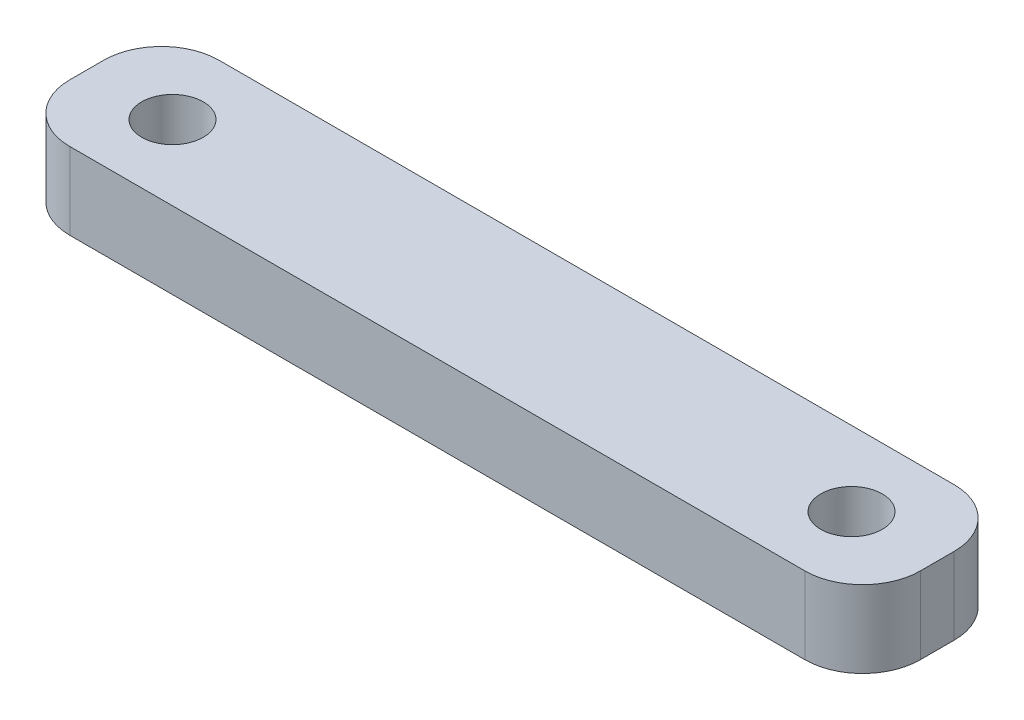
ISO-10303-21;
HEADER;
FILE_DESCRIPTION(('STEP AP214'),'2;1');
FILE_NAME('part.step','',(''),(''),'','','');
FILE_SCHEMA(('AUTOMOTIVE_DESIGN { 1 0 10303 214 1 1 1 1 }'));
ENDSEC;
DATA;
#1=APPLICATION_CONTEXT('core data for automotive mechanical design processes');
#2=APPLICATION_PROTOCOL_DEFINITION('international standard','automotive_design',2000,#1);
#3=PRODUCT_CONTEXT('',#1,'mechanical');
#4=PRODUCT('Part','Part','',(#3));
#5=PRODUCT_RELATED_PRODUCT_CATEGORY('part','',(#4));
#6=PRODUCT_DEFINITION_FORMATION('','',#4);
#7=PRODUCT_DEFINITION_CONTEXT('part definition',#1,'design');
#8=PRODUCT_DEFINITION('design','',#6,#7);
#9=PRODUCT_DEFINITION_SHAPE('','',#8);
#10=(LENGTH_UNIT() NAMED_UNIT(*) SI_UNIT(.MILLI.,.METRE.));
#11=(NAMED_UNIT(*) PLANE_ANGLE_UNIT() SI_UNIT($,.RADIAN.));
#12=(NAMED_UNIT(*) SI_UNIT($,.STERADIAN.) SOLID_ANGLE_UNIT());
#13=UNCERTAINTY_MEASURE_WITH_UNIT(LENGTH_MEASURE(1.E-05),#10,'distance_accuracy_value','');
#14=(GEOMETRIC_REPRESENTATION_CONTEXT(3) GLOBAL_UNCERTAINTY_ASSIGNED_CONTEXT((#13)) GLOBAL_UNIT_ASSIGNED_CONTEXT((#10,
#11,#12)) REPRESENTATION_CONTEXT('',''));
#15=CARTESIAN_POINT('',(0.,0.,0.));
#16=DIRECTION('',(0.,0.,1.));
#17=DIRECTION('',(1.,0.,0.));
#18=AXIS2_PLACEMENT_3D('',#15,#16,#17);
#19=CARTESIAN_POINT('',(0.,4.,0.));
#20=DIRECTION('',(0.,1.,0.));
#21=DIRECTION('',(0.,0.,1.));
#22=AXIS2_PLACEMENT_3D('',#19,#20,#21);
#23=PLANE('',#22);
#24=CARTESIAN_POINT('',(-17.65,4.,0.));
#25=DIRECTION('',(0.,1.,0.));
#26=DIRECTION('',(0.,0.,1.));
#27=AXIS2_PLACEMENT_3D('',#24,#25,#26);
#28=CIRCLE('',#27,1.6);
#29=CARTESIAN_POINT('',(-17.65,4.,1.6));
#30=VERTEX_POINT('',#29);
#31=EDGE_CURVE('E129',#30,#30,#28,.T.);
#32=ORIENTED_EDGE('',*,*,#31,.F.);
#33=EDGE_LOOP('',(#32));
#34=FACE_BOUND('',#33,.T.);
#35=DIRECTION('',(-1.,0.,0.));
#36=VECTOR('',#35,1.);
#37=CARTESIAN_POINT('',(22.1088511383018,4.,-3.88134356355615));
#38=LINE('',#37,#36);
#39=CARTESIAN_POINT('',(19.1088511383018,4.,-3.88134356355615));
#40=VERTEX_POINT('',#39);
#41=CARTESIAN_POINT('',(-19.1088511383018,4.,-3.88134356355615));
#42=VERTEX_POINT('',#41);
#43=EDGE_CURVE('E138',#40,#42,#38,.T.);
#44=ORIENTED_EDGE('',*,*,#43,.T.);
#45=CARTESIAN_POINT('',(-19.1088511383018,4.,-0.881343563556149));
#46=DIRECTION('',(0.,1.,0.));
#47=DIRECTION('',(0.,0.,1.));
#48=AXIS2_PLACEMENT_3D('',#45,#46,#47);
#49=CIRCLE('',#48,3.);
#50=CARTESIAN_POINT('',(-22.1088511383018,4.,-0.881343563556149));
#51=VERTEX_POINT('',#50);
#52=EDGE_CURVE('E157',#42,#51,#49,.T.);
#53=ORIENTED_EDGE('',*,*,#52,.T.);
#54=DIRECTION('',(0.,0.,1.));
#55=VECTOR('',#54,1.);
#56=CARTESIAN_POINT('',(-22.1088511383018,4.,3.88134356355615));
#57=LINE('',#56,#55);
#58=CARTESIAN_POINT('',(-22.1088511383018,4.,0.881343563556152));
#59=VERTEX_POINT('',#58);
#60=EDGE_CURVE('E121',#51,#59,#57,.T.);
#61=ORIENTED_EDGE('',*,*,#60,.T.);
#62=CARTESIAN_POINT('',(-19.1088511383018,4.,0.881343563556152));
#63=DIRECTION('',(0.,1.,0.));
#64=DIRECTION('',(0.,0.,1.));
#65=AXIS2_PLACEMENT_3D('',#62,#63,#64);
#66=CIRCLE('',#65,3.);
#67=CARTESIAN_POINT('',(-19.1088511383018,4.,3.88134356355615));
#68=VERTEX_POINT('',#67);
#69=EDGE_CURVE('E152',#59,#68,#66,.T.);
#70=ORIENTED_EDGE('',*,*,#69,.T.);
#71=DIRECTION('',(1.,0.,0.));
#72=VECTOR('',#71,1.);
#73=CARTESIAN_POINT('',(22.1088511383018,4.,3.88134356355615));
#74=LINE('',#73,#72);
#75=CARTESIAN_POINT('',(19.1088511383018,4.,3.88134356355615));
#76=VERTEX_POINT('',#75);
#77=EDGE_CURVE('E168',#68,#76,#74,.T.);
#78=ORIENTED_EDGE('',*,*,#77,.T.);
#79=CARTESIAN_POINT('',(19.1088511383018,4.,0.881343563556152));
#80=DIRECTION('',(0.,1.,0.));
#81=DIRECTION('',(0.,0.,1.));
#82=AXIS2_PLACEMENT_3D('',#79,#80,#81);
#83=CIRCLE('',#82,3.);
#84=CARTESIAN_POINT('',(22.1088511383018,4.,0.881343563556152));
#85=VERTEX_POINT('',#84);
#86=EDGE_CURVE('E57',#76,#85,#83,.T.);
#87=ORIENTED_EDGE('',*,*,#86,.T.);
#88=DIRECTION('',(0.,0.,-1.));
#89=VECTOR('',#88,1.);
#90=CARTESIAN_POINT('',(22.1088511383018,4.,3.88134356355615));
#91=LINE('',#90,#89);
#92=CARTESIAN_POINT('',(22.1088511383018,4.,-0.881343563556149));
#93=VERTEX_POINT('',#92);
#94=EDGE_CURVE('E176',#85,#93,#91,.T.);
#95=ORIENTED_EDGE('',*,*,#94,.T.);
#96=CARTESIAN_POINT('',(19.1088511383018,4.,-0.881343563556149));
#97=DIRECTION('',(0.,1.,0.));
#98=DIRECTION('',(0.,0.,1.));
#99=AXIS2_PLACEMENT_3D('',#96,#97,#98);
#100=CIRCLE('',#99,3.);
#101=EDGE_CURVE('E155',#93,#40,#100,.T.);
#102=ORIENTED_EDGE('',*,*,#101,.T.);
#103=EDGE_LOOP('',(#44,#53,#61,#70,#78,#87,#95,#102));
#104=FACE_BOUND('',#103,.T.);
#105=CARTESIAN_POINT('',(17.65,4.,0.));
#106=DIRECTION('',(0.,1.,0.));
#107=DIRECTION('',(0.,0.,-1.));
#108=AXIS2_PLACEMENT_3D('',#105,#106,#107);
#109=CIRCLE('',#108,1.6);
#110=CARTESIAN_POINT('',(17.65,4.,-1.59999999999999));
#111=VERTEX_POINT('',#110);
#112=EDGE_CURVE('E183',#111,#111,#109,.T.);
#113=ORIENTED_EDGE('',*,*,#112,.F.);
#114=EDGE_LOOP('',(#113));
#115=FACE_BOUND('',#114,.T.);
#116=ADVANCED_FACE('F35',(#34,#104,#115),#23,.T.);
#117=CARTESIAN_POINT('',(0.,0.,0.));
#118=DIRECTION('',(0.,1.,0.));
#119=DIRECTION('',(0.,0.,1.));
#120=AXIS2_PLACEMENT_3D('',#117,#118,#119);
#121=PLANE('',#120);
#122=DIRECTION('',(0.,0.,1.));
#123=VECTOR('',#122,1.);
#124=CARTESIAN_POINT('',(-22.1088511383018,0.,3.88134356355615));
#125=LINE('',#124,#123);
#126=CARTESIAN_POINT('',(-22.1088511383018,0.,-0.881343563556149));
#127=VERTEX_POINT('',#126);
#128=CARTESIAN_POINT('',(-22.1088511383018,0.,0.881343563556152));
#129=VERTEX_POINT('',#128);
#130=EDGE_CURVE('E118',#127,#129,#125,.T.);
#131=ORIENTED_EDGE('',*,*,#130,.F.);
#132=CARTESIAN_POINT('',(-19.1088511383018,0.,-0.881343563556149));
#133=DIRECTION('',(0.,1.,0.));
#134=DIRECTION('',(0.,0.,1.));
#135=AXIS2_PLACEMENT_3D('',#132,#133,#134);
#136=CIRCLE('',#135,3.);
#137=CARTESIAN_POINT('',(-19.1088511383018,0.,-3.88134356355615));
#138=VERTEX_POINT('',#137);
#139=EDGE_CURVE('E101',#127,#138,#136,.F.);
#140=ORIENTED_EDGE('',*,*,#139,.T.);
#141=DIRECTION('',(-1.,0.,0.));
#142=VECTOR('',#141,1.);
#143=CARTESIAN_POINT('',(22.1088511383018,0.,-3.88134356355615));
#144=LINE('',#143,#142);
#145=CARTESIAN_POINT('',(19.1088511383018,0.,-3.88134356355615));
#146=VERTEX_POINT('',#145);
#147=EDGE_CURVE('E142',#146,#138,#144,.T.);
#148=ORIENTED_EDGE('',*,*,#147,.F.);
#149=CARTESIAN_POINT('',(19.1088511383018,0.,-0.881343563556149));
#150=DIRECTION('',(0.,1.,0.));
#151=DIRECTION('',(0.,0.,1.));
#152=AXIS2_PLACEMENT_3D('',#149,#150,#151);
#153=CIRCLE('',#152,3.);
#154=CARTESIAN_POINT('',(22.1088511383018,0.,-0.881343563556149));
#155=VERTEX_POINT('',#154);
#156=EDGE_CURVE('E112',#146,#155,#153,.F.);
#157=ORIENTED_EDGE('',*,*,#156,.T.);
#158=DIRECTION('',(0.,0.,-1.));
#159=VECTOR('',#158,1.);
#160=CARTESIAN_POINT('',(22.1088511383018,0.,3.88134356355615));
#161=LINE('',#160,#159);
#162=CARTESIAN_POINT('',(22.1088511383018,0.,0.881343563556152));
#163=VERTEX_POINT('',#162);
#164=EDGE_CURVE('E132',#163,#155,#161,.T.);
#165=ORIENTED_EDGE('',*,*,#164,.F.);
#166=CARTESIAN_POINT('',(19.1088511383018,0.,0.881343563556152));
#167=DIRECTION('',(0.,1.,0.));
#168=DIRECTION('',(0.,0.,1.));
#169=AXIS2_PLACEMENT_3D('',#166,#167,#168);
#170=CIRCLE('',#169,3.);
#171=CARTESIAN_POINT('',(19.1088511383018,0.,3.88134356355615));
#172=VERTEX_POINT('',#171);
#173=EDGE_CURVE('E146',#163,#172,#170,.F.);
#174=ORIENTED_EDGE('',*,*,#173,.T.);
#175=DIRECTION('',(1.,0.,0.));
#176=VECTOR('',#175,1.);
#177=CARTESIAN_POINT('',(22.1088511383018,0.,3.88134356355615));
#178=LINE('',#177,#176);
#179=CARTESIAN_POINT('',(-19.1088511383018,0.,3.88134356355615));
#180=VERTEX_POINT('',#179);
#181=EDGE_CURVE('E128',#180,#172,#178,.T.);
#182=ORIENTED_EDGE('',*,*,#181,.F.);
#183=CARTESIAN_POINT('',(-19.1088511383018,0.,0.881343563556152));
#184=DIRECTION('',(0.,1.,0.));
#185=DIRECTION('',(0.,0.,1.));
#186=AXIS2_PLACEMENT_3D('',#183,#184,#185);
#187=CIRCLE('',#186,3.);
#188=EDGE_CURVE('E122',#180,#129,#187,.F.);
#189=ORIENTED_EDGE('',*,*,#188,.T.);
#190=EDGE_LOOP('',(#131,#140,#148,#157,#165,#174,#182,#189));
#191=FACE_BOUND('',#190,.T.);
#192=CARTESIAN_POINT('',(-17.65,0.,0.));
#193=DIRECTION('',(0.,1.,0.));
#194=DIRECTION('',(0.,0.,1.));
#195=AXIS2_PLACEMENT_3D('',#192,#193,#194);
#196=CIRCLE('',#195,1.6);
#197=CARTESIAN_POINT('',(-17.65,0.,1.6));
#198=VERTEX_POINT('',#197);
#199=EDGE_CURVE('E135',#198,#198,#196,.T.);
#200=ORIENTED_EDGE('',*,*,#199,.T.);
#201=EDGE_LOOP('',(#200));
#202=FACE_BOUND('',#201,.T.);
#203=CARTESIAN_POINT('',(17.65,0.,0.));
#204=DIRECTION('',(0.,1.,0.));
#205=DIRECTION('',(0.,0.,-1.));
#206=AXIS2_PLACEMENT_3D('',#203,#204,#205);
#207=CIRCLE('',#206,1.6);
#208=CARTESIAN_POINT('',(17.65,0.,-1.59999999999999));
#209=VERTEX_POINT('',#208);
#210=EDGE_CURVE('E185',#209,#209,#207,.T.);
#211=ORIENTED_EDGE('',*,*,#210,.T.);
#212=EDGE_LOOP('',(#211));
#213=FACE_BOUND('',#212,.T.);
#214=ADVANCED_FACE('F125',(#191,#202,#213),#121,.F.);
#215=CARTESIAN_POINT('',(-22.1088511383018,4.,3.88134356355615));
#216=DIRECTION('',(1.,0.,0.));
#217=DIRECTION('',(0.,0.,-1.));
#218=AXIS2_PLACEMENT_3D('',#215,#216,#217);
#219=PLANE('',#218);
#220=ORIENTED_EDGE('',*,*,#60,.F.);
#221=DIRECTION('',(0.,-1.,0.));
#222=VECTOR('',#221,1.);
#223=CARTESIAN_POINT('',(-22.1088511383018,4.,-0.881343563556149));
#224=LINE('',#223,#222);
#225=EDGE_CURVE('E105',#51,#127,#224,.T.);
#226=ORIENTED_EDGE('',*,*,#225,.T.);
#227=ORIENTED_EDGE('',*,*,#130,.T.);
#228=DIRECTION('',(0.,-1.,0.));
#229=VECTOR('',#228,1.);
#230=CARTESIAN_POINT('',(-22.1088511383018,4.,0.881343563556152));
#231=LINE('',#230,#229);
#232=EDGE_CURVE('E123',#129,#59,#231,.F.);
#233=ORIENTED_EDGE('',*,*,#232,.T.);
#234=EDGE_LOOP('',(#220,#226,#227,#233));
#235=FACE_BOUND('',#234,.T.);
#236=ADVANCED_FACE('F117',(#235),#219,.F.);
#237=CARTESIAN_POINT('',(22.1088511383018,4.,3.88134356355615));
#238=DIRECTION('',(0.,0.,-1.));
#239=DIRECTION('',(-1.,0.,0.));
#240=AXIS2_PLACEMENT_3D('',#237,#238,#239);
#241=PLANE('',#240);
#242=ORIENTED_EDGE('',*,*,#181,.T.);
#243=DIRECTION('',(0.,-1.,0.));
#244=VECTOR('',#243,1.);
#245=CARTESIAN_POINT('',(19.1088511383018,4.,3.88134356355615));
#246=LINE('',#245,#244);
#247=EDGE_CURVE('E11',#172,#76,#246,.F.);
#248=ORIENTED_EDGE('',*,*,#247,.T.);
#249=ORIENTED_EDGE('',*,*,#77,.F.);
#250=DIRECTION('',(0.,-1.,0.));
#251=VECTOR('',#250,1.);
#252=CARTESIAN_POINT('',(-19.1088511383018,4.,3.88134356355615));
#253=LINE('',#252,#251);
#254=EDGE_CURVE('E43',#68,#180,#253,.T.);
#255=ORIENTED_EDGE('',*,*,#254,.T.);
#256=EDGE_LOOP('',(#242,#248,#249,#255));
#257=FACE_BOUND('',#256,.T.);
#258=ADVANCED_FACE('F166',(#257),#241,.F.);
#259=CARTESIAN_POINT('',(22.1088511383018,4.,3.88134356355615));
#260=DIRECTION('',(-1.,0.,0.));
#261=DIRECTION('',(0.,0.,1.));
#262=AXIS2_PLACEMENT_3D('',#259,#260,#261);
#263=PLANE('',#262);
#264=ORIENTED_EDGE('',*,*,#164,.T.);
#265=DIRECTION('',(0.,-1.,0.));
#266=VECTOR('',#265,1.);
#267=CARTESIAN_POINT('',(22.1088511383018,4.,-0.881343563556149));
#268=LINE('',#267,#266);
#269=EDGE_CURVE('E50',#155,#93,#268,.F.);
#270=ORIENTED_EDGE('',*,*,#269,.T.);
#271=ORIENTED_EDGE('',*,*,#94,.F.);
#272=DIRECTION('',(0.,-1.,0.));
#273=VECTOR('',#272,1.);
#274=CARTESIAN_POINT('',(22.1088511383018,4.,0.881343563556152));
#275=LINE('',#274,#273);
#276=EDGE_CURVE('E159',#85,#163,#275,.T.);
#277=ORIENTED_EDGE('',*,*,#276,.T.);
#278=EDGE_LOOP('',(#264,#270,#271,#277));
#279=FACE_BOUND('',#278,.T.);
#280=ADVANCED_FACE('F175',(#279),#263,.F.);
#281=CARTESIAN_POINT('',(22.1088511383018,4.,-3.88134356355615));
#282=DIRECTION('',(0.,0.,1.));
#283=DIRECTION('',(1.,0.,0.));
#284=AXIS2_PLACEMENT_3D('',#281,#282,#283);
#285=PLANE('',#284);
#286=ORIENTED_EDGE('',*,*,#147,.T.);
#287=DIRECTION('',(0.,-1.,0.));
#288=VECTOR('',#287,1.);
#289=CARTESIAN_POINT('',(-19.1088511383018,4.,-3.88134356355615));
#290=LINE('',#289,#288);
#291=EDGE_CURVE('E106',#138,#42,#290,.F.);
#292=ORIENTED_EDGE('',*,*,#291,.T.);
#293=ORIENTED_EDGE('',*,*,#43,.F.);
#294=DIRECTION('',(0.,-1.,0.));
#295=VECTOR('',#294,1.);
#296=CARTESIAN_POINT('',(19.1088511383018,4.,-3.88134356355615));
#297=LINE('',#296,#295);
#298=EDGE_CURVE('E111',#40,#146,#297,.T.);
#299=ORIENTED_EDGE('',*,*,#298,.T.);
#300=EDGE_LOOP('',(#286,#292,#293,#299));
#301=FACE_BOUND('',#300,.T.);
#302=ADVANCED_FACE('F206',(#301),#285,.F.);
#303=CARTESIAN_POINT('',(-17.65,4.,0.));
#304=DIRECTION('',(0.,-1.,0.));
#305=DIRECTION('',(0.,0.,-1.));
#306=AXIS2_PLACEMENT_3D('',#303,#304,#305);
#307=CYLINDRICAL_SURFACE('',#306,1.6);
#308=ORIENTED_EDGE('',*,*,#31,.T.);
#309=EDGE_LOOP('',(#308));
#310=FACE_BOUND('',#309,.T.);
#311=ORIENTED_EDGE('',*,*,#199,.F.);
#312=EDGE_LOOP('',(#311));
#313=FACE_BOUND('',#312,.T.);
#314=ADVANCED_FACE('F203',(#310,#313),#307,.F.);
#315=CARTESIAN_POINT('',(17.65,4.,0.));
#316=DIRECTION('',(0.,-1.,0.));
#317=DIRECTION('',(0.,0.,-1.));
#318=AXIS2_PLACEMENT_3D('',#315,#316,#317);
#319=CYLINDRICAL_SURFACE('',#318,1.6);
#320=ORIENTED_EDGE('',*,*,#112,.T.);
#321=EDGE_LOOP('',(#320));
#322=FACE_BOUND('',#321,.T.);
#323=ORIENTED_EDGE('',*,*,#210,.F.);
#324=EDGE_LOOP('',(#323));
#325=FACE_BOUND('',#324,.T.);
#326=ADVANCED_FACE('F191',(#322,#325),#319,.F.);
#327=CARTESIAN_POINT('',(-19.1088511383018,4.,-0.881343563556149));
#328=DIRECTION('',(0.,-1.,0.));
#329=DIRECTION('',(0.,0.,-1.));
#330=AXIS2_PLACEMENT_3D('',#327,#328,#329);
#331=CYLINDRICAL_SURFACE('',#330,3.);
#332=ORIENTED_EDGE('',*,*,#52,.F.);
#333=ORIENTED_EDGE('',*,*,#291,.F.);
#334=ORIENTED_EDGE('',*,*,#139,.F.);
#335=ORIENTED_EDGE('',*,*,#225,.F.);
#336=EDGE_LOOP('',(#332,#333,#334,#335));
#337=FACE_BOUND('',#336,.T.);
#338=ADVANCED_FACE('F104',(#337),#331,.T.);
#339=CARTESIAN_POINT('',(19.1088511383018,4.,-0.881343563556149));
#340=DIRECTION('',(0.,-1.,0.));
#341=DIRECTION('',(0.,0.,-1.));
#342=AXIS2_PLACEMENT_3D('',#339,#340,#341);
#343=CYLINDRICAL_SURFACE('',#342,3.);
#344=ORIENTED_EDGE('',*,*,#101,.F.);
#345=ORIENTED_EDGE('',*,*,#269,.F.);
#346=ORIENTED_EDGE('',*,*,#156,.F.);
#347=ORIENTED_EDGE('',*,*,#298,.F.);
#348=EDGE_LOOP('',(#344,#345,#346,#347));
#349=FACE_BOUND('',#348,.T.);
#350=ADVANCED_FACE('F218',(#349),#343,.T.);
#351=CARTESIAN_POINT('',(19.1088511383018,4.,0.881343563556152));
#352=DIRECTION('',(0.,-1.,0.));
#353=DIRECTION('',(0.,0.,-1.));
#354=AXIS2_PLACEMENT_3D('',#351,#352,#353);
#355=CYLINDRICAL_SURFACE('',#354,3.);
#356=ORIENTED_EDGE('',*,*,#86,.F.);
#357=ORIENTED_EDGE('',*,*,#247,.F.);
#358=ORIENTED_EDGE('',*,*,#173,.F.);
#359=ORIENTED_EDGE('',*,*,#276,.F.);
#360=EDGE_LOOP('',(#356,#357,#358,#359));
#361=FACE_BOUND('',#360,.T.);
#362=ADVANCED_FACE('F174',(#361),#355,.T.);
#363=CARTESIAN_POINT('',(-19.1088511383018,4.,0.881343563556152));
#364=DIRECTION('',(0.,-1.,0.));
#365=DIRECTION('',(0.,0.,-1.));
#366=AXIS2_PLACEMENT_3D('',#363,#364,#365);
#367=CYLINDRICAL_SURFACE('',#366,3.);
#368=ORIENTED_EDGE('',*,*,#69,.F.);
#369=ORIENTED_EDGE('',*,*,#232,.F.);
#370=ORIENTED_EDGE('',*,*,#188,.F.);
#371=ORIENTED_EDGE('',*,*,#254,.F.);
#372=EDGE_LOOP('',(#368,#369,#370,#371));
#373=FACE_BOUND('',#372,.T.);
#374=ADVANCED_FACE('F37',(#373),#367,.T.);
#375=CLOSED_SHELL('',(#116,#214,#236,#258,#280,#302,#314,#326,#338,#350,#362,#374));
#376=MANIFOLD_SOLID_BREP('B2',#375);
#377=ADVANCED_BREP_SHAPE_REPRESENTATION('',(#18,#376),#14);
#378=SHAPE_DEFINITION_REPRESENTATION(#9,#377);
ENDSEC;
END-ISO-10303-21;
